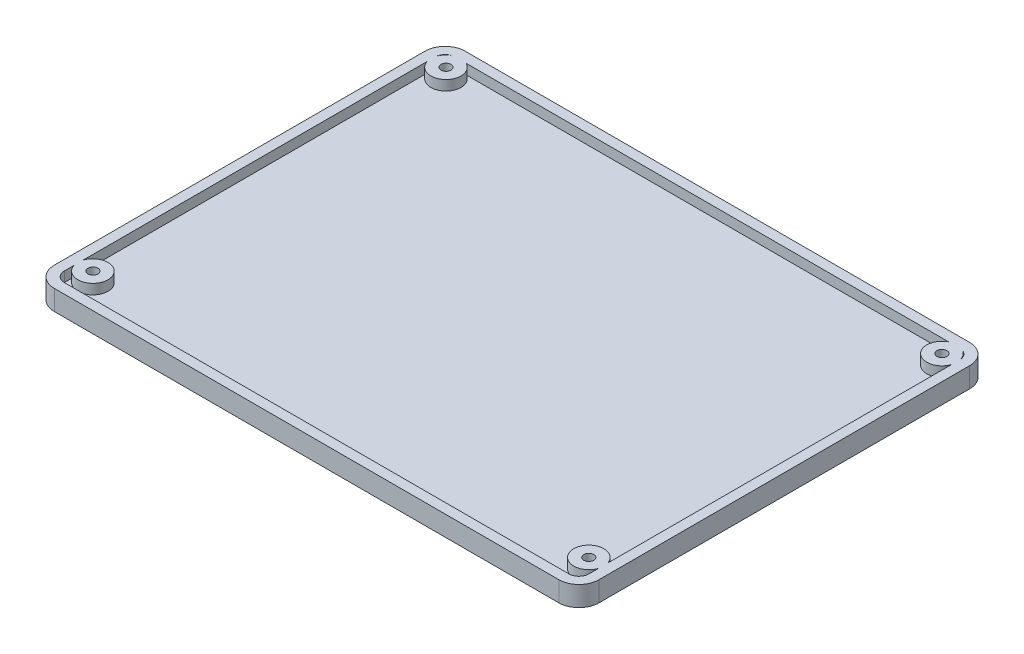
ISO-10303-21;
HEADER;
FILE_DESCRIPTION(('STEP AP214'),'2;1');
FILE_NAME('part.step','',(''),(''),'','','');
FILE_SCHEMA(('AUTOMOTIVE_DESIGN { 1 0 10303 214 1 1 1 1 }'));
ENDSEC;
DATA;
#1=APPLICATION_CONTEXT('core data for automotive mechanical design processes');
#2=APPLICATION_PROTOCOL_DEFINITION('international standard','automotive_design',2000,#1);
#3=PRODUCT_CONTEXT('',#1,'mechanical');
#4=PRODUCT('Part','Part','',(#3));
#5=PRODUCT_RELATED_PRODUCT_CATEGORY('part','',(#4));
#6=PRODUCT_DEFINITION_FORMATION('','',#4);
#7=PRODUCT_DEFINITION_CONTEXT('part definition',#1,'design');
#8=PRODUCT_DEFINITION('design','',#6,#7);
#9=PRODUCT_DEFINITION_SHAPE('','',#8);
#10=(LENGTH_UNIT() NAMED_UNIT(*) SI_UNIT(.MILLI.,.METRE.));
#11=(NAMED_UNIT(*) PLANE_ANGLE_UNIT() SI_UNIT($,.RADIAN.));
#12=(NAMED_UNIT(*) SI_UNIT($,.STERADIAN.) SOLID_ANGLE_UNIT());
#13=UNCERTAINTY_MEASURE_WITH_UNIT(LENGTH_MEASURE(1.E-05),#10,'distance_accuracy_value','');
#14=(GEOMETRIC_REPRESENTATION_CONTEXT(3) GLOBAL_UNCERTAINTY_ASSIGNED_CONTEXT((#13)) GLOBAL_UNIT_ASSIGNED_CONTEXT((#10,
#11,#12)) REPRESENTATION_CONTEXT('',''));
#15=CARTESIAN_POINT('',(0.,0.,0.));
#16=DIRECTION('',(0.,0.,1.));
#17=DIRECTION('',(1.,0.,0.));
#18=AXIS2_PLACEMENT_3D('',#15,#16,#17);
#19=CARTESIAN_POINT('',(0.,6.,0.));
#20=DIRECTION('',(0.,1.,0.));
#21=DIRECTION('',(0.,0.,1.));
#22=AXIS2_PLACEMENT_3D('',#19,#20,#21);
#23=PLANE('',#22);
#24=CARTESIAN_POINT('',(75.4,6.,-55.4));
#25=DIRECTION('',(0.,1.,0.));
#26=DIRECTION('',(0.,0.,1.));
#27=AXIS2_PLACEMENT_3D('',#24,#25,#26);
#28=CIRCLE('',#27,3.);
#29=CARTESIAN_POINT('',(78.3732612938431,6.,-55.7996464419139));
#30=VERTEX_POINT('',#29);
#31=CARTESIAN_POINT('',(76.445365255341,6.,-58.2119764371214));
#32=VERTEX_POINT('',#31);
#33=EDGE_CURVE('E61',#30,#32,#28,.T.);
#34=ORIENTED_EDGE('',*,*,#33,.F.);
#35=CARTESIAN_POINT('',(74.1074112270485,6.,-54.3669834642291));
#36=DIRECTION('',(0.,1.,0.));
#37=DIRECTION('',(0.,0.,1.));
#38=AXIS2_PLACEMENT_3D('',#35,#36,#37);
#39=CIRCLE('',#38,4.5);
#40=EDGE_CURVE('E280',#30,#32,#39,.T.);
#41=ORIENTED_EDGE('',*,*,#40,.T.);
#42=EDGE_LOOP('',(#34,#41));
#43=FACE_BOUND('',#42,.T.);
#44=CARTESIAN_POINT('',(-75.4,6.,-55.4));
#45=DIRECTION('',(0.,1.,0.));
#46=DIRECTION('',(0.,0.,1.));
#47=AXIS2_PLACEMENT_3D('',#44,#45,#46);
#48=CIRCLE('',#47,3.);
#49=CARTESIAN_POINT('',(-76.4270579337473,6.,-58.2187146007935));
#50=VERTEX_POINT('',#49);
#51=CARTESIAN_POINT('',(-78.3778099520177,6.,-55.7642085798885));
#52=VERTEX_POINT('',#51);
#53=EDGE_CURVE('E69',#50,#52,#48,.T.);
#54=ORIENTED_EDGE('',*,*,#53,.F.);
#55=CARTESIAN_POINT('',(-74.1002216155633,6.,-54.3669834642291));
#56=DIRECTION('',(0.,1.,0.));
#57=DIRECTION('',(0.,0.,1.));
#58=AXIS2_PLACEMENT_3D('',#55,#56,#57);
#59=CIRCLE('',#58,4.5);
#60=EDGE_CURVE('E273',#50,#52,#59,.T.);
#61=ORIENTED_EDGE('',*,*,#60,.T.);
#62=EDGE_LOOP('',(#54,#61));
#63=FACE_BOUND('',#62,.T.);
#64=DIRECTION('',(0.,0.,-1.));
#65=VECTOR('',#64,1.);
#66=CARTESIAN_POINT('',(78.4,6.,-61.4));
#67=LINE('',#66,#65);
#68=CARTESIAN_POINT('',(78.4,6.,49.799940355414));
#69=VERTEX_POINT('',#68);
#70=CARTESIAN_POINT('',(78.4,6.,-53.0165458957607));
#71=VERTEX_POINT('',#70);
#72=EDGE_CURVE('E229',#69,#71,#67,.T.);
#73=ORIENTED_EDGE('',*,*,#72,.F.);
#74=CARTESIAN_POINT('',(74.10741122705,6.,51.150377923887));
#75=DIRECTION('',(0.,1.,0.));
#76=DIRECTION('',(0.,0.,1.));
#77=AXIS2_PLACEMENT_3D('',#74,#75,#76);
#78=CIRCLE('',#77,4.5);
#79=CARTESIAN_POINT('',(78.4,6.,52.50081549236));
#80=VERTEX_POINT('',#79);
#81=EDGE_CURVE('E281',#69,#80,#78,.T.);
#82=ORIENTED_EDGE('',*,*,#81,.T.);
#83=CARTESIAN_POINT('',(78.4,6.,55.4));
#84=VERTEX_POINT('',#83);
#85=EDGE_CURVE('E246',#84,#80,#67,.T.);
#86=ORIENTED_EDGE('',*,*,#85,.F.);
#87=CARTESIAN_POINT('',(75.4,6.,55.4));
#88=DIRECTION('',(0.,1.,0.));
#89=DIRECTION('',(0.,0.,1.));
#90=AXIS2_PLACEMENT_3D('',#87,#88,#89);
#91=CIRCLE('',#90,3.);
#92=CARTESIAN_POINT('',(75.4,6.,58.4));
#93=VERTEX_POINT('',#92);
#94=EDGE_CURVE('E264',#93,#84,#91,.T.);
#95=ORIENTED_EDGE('',*,*,#94,.F.);
#96=DIRECTION('',(1.,0.,0.));
#97=VECTOR('',#96,1.);
#98=CARTESIAN_POINT('',(-81.4,6.,58.4));
#99=LINE('',#98,#97);
#100=CARTESIAN_POINT('',(-75.4,6.,58.4));
#101=VERTEX_POINT('',#100);
#102=EDGE_CURVE('E219',#101,#93,#99,.T.);
#103=ORIENTED_EDGE('',*,*,#102,.F.);
#104=CARTESIAN_POINT('',(-75.4,6.,55.4));
#105=DIRECTION('',(0.,1.,0.));
#106=DIRECTION('',(0.,0.,1.));
#107=AXIS2_PLACEMENT_3D('',#104,#105,#106);
#108=CIRCLE('',#107,3.);
#109=CARTESIAN_POINT('',(-78.4,6.,55.4));
#110=VERTEX_POINT('',#109);
#111=EDGE_CURVE('E258',#110,#101,#108,.T.);
#112=ORIENTED_EDGE('',*,*,#111,.F.);
#113=DIRECTION('',(0.,0.,1.));
#114=VECTOR('',#113,1.);
#115=CARTESIAN_POINT('',(-78.4,6.,-61.4));
#116=LINE('',#115,#114);
#117=CARTESIAN_POINT('',(-78.4,6.,52.4777459379352));
#118=VERTEX_POINT('',#117);
#119=EDGE_CURVE('E255',#118,#110,#116,.T.);
#120=ORIENTED_EDGE('',*,*,#119,.F.);
#121=CARTESIAN_POINT('',(-74.1002216155618,6.,51.150377923887));
#122=DIRECTION('',(0.,1.,0.));
#123=DIRECTION('',(0.,0.,1.));
#124=AXIS2_PLACEMENT_3D('',#121,#122,#123);
#125=CIRCLE('',#124,4.5);
#126=CARTESIAN_POINT('',(-78.4,6.,49.8230099098388));
#127=VERTEX_POINT('',#126);
#128=EDGE_CURVE('E287',#118,#127,#125,.T.);
#129=ORIENTED_EDGE('',*,*,#128,.T.);
#130=CARTESIAN_POINT('',(-78.4,6.,-53.0396154501761));
#131=VERTEX_POINT('',#130);
#132=EDGE_CURVE('E261',#131,#127,#116,.T.);
#133=ORIENTED_EDGE('',*,*,#132,.F.);
#134=CARTESIAN_POINT('',(-72.1040308375567,6.,-58.4));
#135=VERTEX_POINT('',#134);
#136=EDGE_CURVE('E269',#131,#135,#59,.T.);
#137=ORIENTED_EDGE('',*,*,#136,.T.);
#138=DIRECTION('',(-1.,0.,0.));
#139=VECTOR('',#138,1.);
#140=CARTESIAN_POINT('',(-81.4,6.,-58.4));
#141=LINE('',#140,#139);
#142=CARTESIAN_POINT('',(72.1112204490419,6.,-58.4));
#143=VERTEX_POINT('',#142);
#144=EDGE_CURVE('E249',#143,#135,#141,.T.);
#145=ORIENTED_EDGE('',*,*,#144,.F.);
#146=EDGE_CURVE('E275',#143,#71,#39,.T.);
#147=ORIENTED_EDGE('',*,*,#146,.T.);
#148=EDGE_LOOP('',(#73,#82,#86,#95,#103,#112,#120,#129,#133,#137,#145,#147));
#149=FACE_BOUND('',#148,.T.);
#150=CARTESIAN_POINT('',(74.10741122705,6.,51.150377923887));
#151=DIRECTION('',(0.,1.,0.));
#152=DIRECTION('',(0.,0.,1.));
#153=AXIS2_PLACEMENT_3D('',#150,#151,#152);
#154=CIRCLE('',#153,1.5);
#155=CARTESIAN_POINT('',(74.10741122705,6.,52.650377923887));
#156=VERTEX_POINT('',#155);
#157=EDGE_CURVE('E337',#156,#156,#154,.T.);
#158=ORIENTED_EDGE('',*,*,#157,.F.);
#159=EDGE_LOOP('',(#158));
#160=FACE_BOUND('',#159,.T.);
#161=CARTESIAN_POINT('',(-74.1002216155633,6.,-54.3669834642291));
#162=DIRECTION('',(0.,1.,0.));
#163=DIRECTION('',(0.,0.,1.));
#164=AXIS2_PLACEMENT_3D('',#161,#162,#163);
#165=CIRCLE('',#164,1.5);
#166=CARTESIAN_POINT('',(-74.1002216155633,6.,-52.8669834642291));
#167=VERTEX_POINT('',#166);
#168=EDGE_CURVE('E353',#167,#167,#165,.T.);
#169=ORIENTED_EDGE('',*,*,#168,.F.);
#170=EDGE_LOOP('',(#169));
#171=FACE_BOUND('',#170,.T.);
#172=DIRECTION('',(0.,0.,-1.));
#173=VECTOR('',#172,1.);
#174=CARTESIAN_POINT('',(81.4,6.,-61.4));
#175=LINE('',#174,#173);
#176=CARTESIAN_POINT('',(81.4,6.,55.4));
#177=VERTEX_POINT('',#176);
#178=CARTESIAN_POINT('',(81.4,6.,-55.4));
#179=VERTEX_POINT('',#178);
#180=EDGE_CURVE('E361',#177,#179,#175,.T.);
#181=ORIENTED_EDGE('',*,*,#180,.T.);
#182=CARTESIAN_POINT('',(75.4,6.,-55.4));
#183=DIRECTION('',(0.,1.,0.));
#184=DIRECTION('',(0.,0.,1.));
#185=AXIS2_PLACEMENT_3D('',#182,#183,#184);
#186=CIRCLE('',#185,6.);
#187=CARTESIAN_POINT('',(75.4,6.,-61.4));
#188=VERTEX_POINT('',#187);
#189=EDGE_CURVE('E427',#179,#188,#186,.T.);
#190=ORIENTED_EDGE('',*,*,#189,.T.);
#191=DIRECTION('',(-1.,0.,0.));
#192=VECTOR('',#191,1.);
#193=CARTESIAN_POINT('',(-81.4,6.,-61.4));
#194=LINE('',#193,#192);
#195=CARTESIAN_POINT('',(-75.4,6.,-61.4));
#196=VERTEX_POINT('',#195);
#197=EDGE_CURVE('E365',#188,#196,#194,.T.);
#198=ORIENTED_EDGE('',*,*,#197,.T.);
#199=CARTESIAN_POINT('',(-75.4,6.,-55.4));
#200=DIRECTION('',(0.,1.,0.));
#201=DIRECTION('',(0.,0.,1.));
#202=AXIS2_PLACEMENT_3D('',#199,#200,#201);
#203=CIRCLE('',#202,6.);
#204=CARTESIAN_POINT('',(-81.4,6.,-55.4));
#205=VERTEX_POINT('',#204);
#206=EDGE_CURVE('E424',#196,#205,#203,.T.);
#207=ORIENTED_EDGE('',*,*,#206,.T.);
#208=DIRECTION('',(0.,0.,1.));
#209=VECTOR('',#208,1.);
#210=CARTESIAN_POINT('',(-81.4,6.,-61.4));
#211=LINE('',#210,#209);
#212=CARTESIAN_POINT('',(-81.4,6.,55.4));
#213=VERTEX_POINT('',#212);
#214=EDGE_CURVE('E370',#205,#213,#211,.T.);
#215=ORIENTED_EDGE('',*,*,#214,.T.);
#216=CARTESIAN_POINT('',(-75.4,6.,55.4));
#217=DIRECTION('',(0.,1.,0.));
#218=DIRECTION('',(0.,0.,1.));
#219=AXIS2_PLACEMENT_3D('',#216,#217,#218);
#220=CIRCLE('',#219,6.);
#221=CARTESIAN_POINT('',(-75.4,6.,61.4));
#222=VERTEX_POINT('',#221);
#223=EDGE_CURVE('E421',#213,#222,#220,.T.);
#224=ORIENTED_EDGE('',*,*,#223,.T.);
#225=DIRECTION('',(1.,0.,0.));
#226=VECTOR('',#225,1.);
#227=CARTESIAN_POINT('',(-81.4,6.,61.4));
#228=LINE('',#227,#226);
#229=CARTESIAN_POINT('',(75.4,6.,61.4));
#230=VERTEX_POINT('',#229);
#231=EDGE_CURVE('E374',#222,#230,#228,.T.);
#232=ORIENTED_EDGE('',*,*,#231,.T.);
#233=CARTESIAN_POINT('',(75.4,6.,55.4));
#234=DIRECTION('',(0.,1.,0.));
#235=DIRECTION('',(0.,0.,1.));
#236=AXIS2_PLACEMENT_3D('',#233,#234,#235);
#237=CIRCLE('',#236,6.);
#238=EDGE_CURVE('E418',#230,#177,#237,.T.);
#239=ORIENTED_EDGE('',*,*,#238,.T.);
#240=EDGE_LOOP('',(#181,#190,#198,#207,#215,#224,#232,#239));
#241=FACE_BOUND('',#240,.T.);
#242=CARTESIAN_POINT('',(74.1074112270485,6.,-54.3669834642291));
#243=DIRECTION('',(0.,1.,0.));
#244=DIRECTION('',(0.,0.,1.));
#245=AXIS2_PLACEMENT_3D('',#242,#243,#244);
#246=CIRCLE('',#245,1.5);
#247=CARTESIAN_POINT('',(74.1074112270485,6.,-52.8669834642291));
#248=VERTEX_POINT('',#247);
#249=EDGE_CURVE('E345',#248,#248,#246,.T.);
#250=ORIENTED_EDGE('',*,*,#249,.F.);
#251=EDGE_LOOP('',(#250));
#252=FACE_BOUND('',#251,.T.);
#253=CARTESIAN_POINT('',(-74.1002216155618,6.,51.150377923887));
#254=DIRECTION('',(0.,1.,0.));
#255=DIRECTION('',(0.,0.,1.));
#256=AXIS2_PLACEMENT_3D('',#253,#254,#255);
#257=CIRCLE('',#256,1.5);
#258=CARTESIAN_POINT('',(-74.1002216155618,6.,52.650377923887));
#259=VERTEX_POINT('',#258);
#260=EDGE_CURVE('E329',#259,#259,#257,.T.);
#261=ORIENTED_EDGE('',*,*,#260,.F.);
#262=EDGE_LOOP('',(#261));
#263=FACE_BOUND('',#262,.T.);
#264=ADVANCED_FACE('F45',(#43,#63,#149,#160,#171,#241,#252,#263),#23,.T.);
#265=CARTESIAN_POINT('',(0.,0.,0.));
#266=DIRECTION('',(0.,1.,0.));
#267=DIRECTION('',(0.,0.,1.));
#268=AXIS2_PLACEMENT_3D('',#265,#266,#267);
#269=PLANE('',#268);
#270=DIRECTION('',(-1.,0.,0.));
#271=VECTOR('',#270,1.);
#272=CARTESIAN_POINT('',(-81.4,0.,-61.4));
#273=LINE('',#272,#271);
#274=CARTESIAN_POINT('',(75.4,0.,-61.4));
#275=VERTEX_POINT('',#274);
#276=CARTESIAN_POINT('',(-75.4,0.,-61.4));
#277=VERTEX_POINT('',#276);
#278=EDGE_CURVE('E382',#275,#277,#273,.T.);
#279=ORIENTED_EDGE('',*,*,#278,.F.);
#280=CARTESIAN_POINT('',(75.4,0.,-55.4));
#281=DIRECTION('',(0.,1.,0.));
#282=DIRECTION('',(0.,0.,1.));
#283=AXIS2_PLACEMENT_3D('',#280,#281,#282);
#284=CIRCLE('',#283,6.);
#285=CARTESIAN_POINT('',(81.4,0.,-55.4));
#286=VERTEX_POINT('',#285);
#287=EDGE_CURVE('E408',#275,#286,#284,.F.);
#288=ORIENTED_EDGE('',*,*,#287,.T.);
#289=DIRECTION('',(0.,0.,-1.));
#290=VECTOR('',#289,1.);
#291=CARTESIAN_POINT('',(81.4,0.,-61.4));
#292=LINE('',#291,#290);
#293=CARTESIAN_POINT('',(81.4,0.,55.4));
#294=VERTEX_POINT('',#293);
#295=EDGE_CURVE('E357',#294,#286,#292,.T.);
#296=ORIENTED_EDGE('',*,*,#295,.F.);
#297=CARTESIAN_POINT('',(75.4,0.,55.4));
#298=DIRECTION('',(0.,1.,0.));
#299=DIRECTION('',(0.,0.,1.));
#300=AXIS2_PLACEMENT_3D('',#297,#298,#299);
#301=CIRCLE('',#300,6.);
#302=CARTESIAN_POINT('',(75.4,0.,61.4));
#303=VERTEX_POINT('',#302);
#304=EDGE_CURVE('E399',#294,#303,#301,.F.);
#305=ORIENTED_EDGE('',*,*,#304,.T.);
#306=DIRECTION('',(1.,0.,0.));
#307=VECTOR('',#306,1.);
#308=CARTESIAN_POINT('',(-81.4,0.,61.4));
#309=LINE('',#308,#307);
#310=CARTESIAN_POINT('',(-75.4,0.,61.4));
#311=VERTEX_POINT('',#310);
#312=EDGE_CURVE('E366',#311,#303,#309,.T.);
#313=ORIENTED_EDGE('',*,*,#312,.F.);
#314=CARTESIAN_POINT('',(-75.4,0.,55.4));
#315=DIRECTION('',(0.,1.,0.));
#316=DIRECTION('',(0.,0.,1.));
#317=AXIS2_PLACEMENT_3D('',#314,#315,#316);
#318=CIRCLE('',#317,6.);
#319=CARTESIAN_POINT('',(-81.4,0.,55.4));
#320=VERTEX_POINT('',#319);
#321=EDGE_CURVE('E402',#311,#320,#318,.F.);
#322=ORIENTED_EDGE('',*,*,#321,.T.);
#323=DIRECTION('',(0.,0.,1.));
#324=VECTOR('',#323,1.);
#325=CARTESIAN_POINT('',(-81.4,0.,-61.4));
#326=LINE('',#325,#324);
#327=CARTESIAN_POINT('',(-81.4,0.,-55.4));
#328=VERTEX_POINT('',#327);
#329=EDGE_CURVE('E386',#328,#320,#326,.T.);
#330=ORIENTED_EDGE('',*,*,#329,.F.);
#331=CARTESIAN_POINT('',(-75.4,0.,-55.4));
#332=DIRECTION('',(0.,1.,0.));
#333=DIRECTION('',(0.,0.,1.));
#334=AXIS2_PLACEMENT_3D('',#331,#332,#333);
#335=CIRCLE('',#334,6.);
#336=EDGE_CURVE('E405',#328,#277,#335,.F.);
#337=ORIENTED_EDGE('',*,*,#336,.T.);
#338=EDGE_LOOP('',(#279,#288,#296,#305,#313,#322,#330,#337));
#339=FACE_BOUND('',#338,.T.);
#340=CARTESIAN_POINT('',(-74.1002216155633,0.,-54.3669834642291));
#341=DIRECTION('',(0.,1.,0.));
#342=DIRECTION('',(0.,0.,1.));
#343=AXIS2_PLACEMENT_3D('',#340,#341,#342);
#344=CIRCLE('',#343,1.5);
#345=CARTESIAN_POINT('',(-74.1002216155633,0.,-52.8669834642291));
#346=VERTEX_POINT('',#345);
#347=EDGE_CURVE('E349',#346,#346,#344,.T.);
#348=ORIENTED_EDGE('',*,*,#347,.T.);
#349=EDGE_LOOP('',(#348));
#350=FACE_BOUND('',#349,.T.);
#351=CARTESIAN_POINT('',(74.1074112270485,0.,-54.3669834642291));
#352=DIRECTION('',(0.,1.,0.));
#353=DIRECTION('',(0.,0.,1.));
#354=AXIS2_PLACEMENT_3D('',#351,#352,#353);
#355=CIRCLE('',#354,1.5);
#356=CARTESIAN_POINT('',(74.1074112270485,0.,-52.8669834642291));
#357=VERTEX_POINT('',#356);
#358=EDGE_CURVE('E341',#357,#357,#355,.T.);
#359=ORIENTED_EDGE('',*,*,#358,.T.);
#360=EDGE_LOOP('',(#359));
#361=FACE_BOUND('',#360,.T.);
#362=CARTESIAN_POINT('',(74.10741122705,0.,51.150377923887));
#363=DIRECTION('',(0.,1.,0.));
#364=DIRECTION('',(0.,0.,1.));
#365=AXIS2_PLACEMENT_3D('',#362,#363,#364);
#366=CIRCLE('',#365,1.5);
#367=CARTESIAN_POINT('',(74.10741122705,0.,52.650377923887));
#368=VERTEX_POINT('',#367);
#369=EDGE_CURVE('E333',#368,#368,#366,.T.);
#370=ORIENTED_EDGE('',*,*,#369,.T.);
#371=EDGE_LOOP('',(#370));
#372=FACE_BOUND('',#371,.T.);
#373=CARTESIAN_POINT('',(-74.1002216155618,0.,51.150377923887));
#374=DIRECTION('',(0.,1.,0.));
#375=DIRECTION('',(0.,0.,1.));
#376=AXIS2_PLACEMENT_3D('',#373,#374,#375);
#377=CIRCLE('',#376,1.5);
#378=CARTESIAN_POINT('',(-74.1002216155618,0.,52.650377923887));
#379=VERTEX_POINT('',#378);
#380=EDGE_CURVE('E328',#379,#379,#377,.T.);
#381=ORIENTED_EDGE('',*,*,#380,.T.);
#382=EDGE_LOOP('',(#381));
#383=FACE_BOUND('',#382,.T.);
#384=ADVANCED_FACE('F456',(#339,#350,#361,#372,#383),#269,.F.);
#385=CARTESIAN_POINT('',(81.4,6.,-61.4));
#386=DIRECTION('',(-1.,0.,0.));
#387=DIRECTION('',(0.,0.,1.));
#388=AXIS2_PLACEMENT_3D('',#385,#386,#387);
#389=PLANE('',#388);
#390=ORIENTED_EDGE('',*,*,#295,.T.);
#391=DIRECTION('',(0.,-1.,0.));
#392=VECTOR('',#391,1.);
#393=CARTESIAN_POINT('',(81.4,6.,-55.4));
#394=LINE('',#393,#392);
#395=EDGE_CURVE('E415',#286,#179,#394,.F.);
#396=ORIENTED_EDGE('',*,*,#395,.T.);
#397=ORIENTED_EDGE('',*,*,#180,.F.);
#398=DIRECTION('',(0.,-1.,0.));
#399=VECTOR('',#398,1.);
#400=CARTESIAN_POINT('',(81.4,6.,55.4));
#401=LINE('',#400,#399);
#402=EDGE_CURVE('E411',#177,#294,#401,.T.);
#403=ORIENTED_EDGE('',*,*,#402,.T.);
#404=EDGE_LOOP('',(#390,#396,#397,#403));
#405=FACE_BOUND('',#404,.T.);
#406=ADVANCED_FACE('F452',(#405),#389,.F.);
#407=CARTESIAN_POINT('',(-81.4,6.,-61.4));
#408=DIRECTION('',(0.,0.,1.));
#409=DIRECTION('',(1.,0.,0.));
#410=AXIS2_PLACEMENT_3D('',#407,#408,#409);
#411=PLANE('',#410);
#412=ORIENTED_EDGE('',*,*,#197,.F.);
#413=DIRECTION('',(0.,-1.,0.));
#414=VECTOR('',#413,1.);
#415=CARTESIAN_POINT('',(75.4,6.,-61.4));
#416=LINE('',#415,#414);
#417=EDGE_CURVE('E395',#188,#275,#416,.T.);
#418=ORIENTED_EDGE('',*,*,#417,.T.);
#419=ORIENTED_EDGE('',*,*,#278,.T.);
#420=DIRECTION('',(0.,-1.,0.));
#421=VECTOR('',#420,1.);
#422=CARTESIAN_POINT('',(-75.4,6.,-61.4));
#423=LINE('',#422,#421);
#424=EDGE_CURVE('E378',#277,#196,#423,.F.);
#425=ORIENTED_EDGE('',*,*,#424,.T.);
#426=EDGE_LOOP('',(#412,#418,#419,#425));
#427=FACE_BOUND('',#426,.T.);
#428=ADVANCED_FACE('F464',(#427),#411,.F.);
#429=CARTESIAN_POINT('',(-81.4,6.,-61.4));
#430=DIRECTION('',(1.,0.,0.));
#431=DIRECTION('',(0.,0.,-1.));
#432=AXIS2_PLACEMENT_3D('',#429,#430,#431);
#433=PLANE('',#432);
#434=ORIENTED_EDGE('',*,*,#214,.F.);
#435=DIRECTION('',(0.,-1.,0.));
#436=VECTOR('',#435,1.);
#437=CARTESIAN_POINT('',(-81.4,6.,-55.4));
#438=LINE('',#437,#436);
#439=EDGE_CURVE('E433',#205,#328,#438,.T.);
#440=ORIENTED_EDGE('',*,*,#439,.T.);
#441=ORIENTED_EDGE('',*,*,#329,.T.);
#442=DIRECTION('',(0.,-1.,0.));
#443=VECTOR('',#442,1.);
#444=CARTESIAN_POINT('',(-81.4,6.,55.4));
#445=LINE('',#444,#443);
#446=EDGE_CURVE('E430',#320,#213,#445,.F.);
#447=ORIENTED_EDGE('',*,*,#446,.T.);
#448=EDGE_LOOP('',(#434,#440,#441,#447));
#449=FACE_BOUND('',#448,.T.);
#450=ADVANCED_FACE('F473',(#449),#433,.F.);
#451=CARTESIAN_POINT('',(-81.4,6.,61.4));
#452=DIRECTION('',(0.,0.,-1.));
#453=DIRECTION('',(-1.,0.,0.));
#454=AXIS2_PLACEMENT_3D('',#451,#452,#453);
#455=PLANE('',#454);
#456=ORIENTED_EDGE('',*,*,#231,.F.);
#457=DIRECTION('',(0.,-1.,0.));
#458=VECTOR('',#457,1.);
#459=CARTESIAN_POINT('',(-75.4,6.,61.4));
#460=LINE('',#459,#458);
#461=EDGE_CURVE('E11',#222,#311,#460,.T.);
#462=ORIENTED_EDGE('',*,*,#461,.T.);
#463=ORIENTED_EDGE('',*,*,#312,.T.);
#464=DIRECTION('',(0.,-1.,0.));
#465=VECTOR('',#464,1.);
#466=CARTESIAN_POINT('',(75.4,6.,61.4));
#467=LINE('',#466,#465);
#468=EDGE_CURVE('E54',#303,#230,#467,.F.);
#469=ORIENTED_EDGE('',*,*,#468,.T.);
#470=EDGE_LOOP('',(#456,#462,#463,#469));
#471=FACE_BOUND('',#470,.T.);
#472=ADVANCED_FACE('F440',(#471),#455,.F.);
#473=CARTESIAN_POINT('',(-74.1002216155633,6.,-54.3669834642291));
#474=DIRECTION('',(0.,-1.,0.));
#475=DIRECTION('',(0.,0.,-1.));
#476=AXIS2_PLACEMENT_3D('',#473,#474,#475);
#477=CYLINDRICAL_SURFACE('',#476,1.5);
#478=ORIENTED_EDGE('',*,*,#168,.T.);
#479=EDGE_LOOP('',(#478));
#480=FACE_BOUND('',#479,.T.);
#481=ORIENTED_EDGE('',*,*,#347,.F.);
#482=EDGE_LOOP('',(#481));
#483=FACE_BOUND('',#482,.T.);
#484=ADVANCED_FACE('F492',(#480,#483),#477,.F.);
#485=CARTESIAN_POINT('',(74.1074112270485,6.,-54.3669834642291));
#486=DIRECTION('',(0.,-1.,0.));
#487=DIRECTION('',(0.,0.,-1.));
#488=AXIS2_PLACEMENT_3D('',#485,#486,#487);
#489=CYLINDRICAL_SURFACE('',#488,1.5);
#490=ORIENTED_EDGE('',*,*,#249,.T.);
#491=EDGE_LOOP('',(#490));
#492=FACE_BOUND('',#491,.T.);
#493=ORIENTED_EDGE('',*,*,#358,.F.);
#494=EDGE_LOOP('',(#493));
#495=FACE_BOUND('',#494,.T.);
#496=ADVANCED_FACE('F514',(#492,#495),#489,.F.);
#497=CARTESIAN_POINT('',(74.10741122705,6.,51.150377923887));
#498=DIRECTION('',(0.,-1.,0.));
#499=DIRECTION('',(0.,0.,-1.));
#500=AXIS2_PLACEMENT_3D('',#497,#498,#499);
#501=CYLINDRICAL_SURFACE('',#500,1.5);
#502=ORIENTED_EDGE('',*,*,#157,.T.);
#503=EDGE_LOOP('',(#502));
#504=FACE_BOUND('',#503,.T.);
#505=ORIENTED_EDGE('',*,*,#369,.F.);
#506=EDGE_LOOP('',(#505));
#507=FACE_BOUND('',#506,.T.);
#508=ADVANCED_FACE('F508',(#504,#507),#501,.F.);
#509=CARTESIAN_POINT('',(-74.1002216155618,6.,51.150377923887));
#510=DIRECTION('',(0.,-1.,0.));
#511=DIRECTION('',(0.,0.,-1.));
#512=AXIS2_PLACEMENT_3D('',#509,#510,#511);
#513=CYLINDRICAL_SURFACE('',#512,1.5);
#514=ORIENTED_EDGE('',*,*,#260,.T.);
#515=EDGE_LOOP('',(#514));
#516=FACE_BOUND('',#515,.T.);
#517=ORIENTED_EDGE('',*,*,#380,.F.);
#518=EDGE_LOOP('',(#517));
#519=FACE_BOUND('',#518,.T.);
#520=ADVANCED_FACE('F504',(#516,#519),#513,.F.);
#521=CARTESIAN_POINT('',(75.4,6.,-55.4));
#522=DIRECTION('',(0.,-1.,0.));
#523=DIRECTION('',(0.,0.,-1.));
#524=AXIS2_PLACEMENT_3D('',#521,#522,#523);
#525=CYLINDRICAL_SURFACE('',#524,6.);
#526=ORIENTED_EDGE('',*,*,#189,.F.);
#527=ORIENTED_EDGE('',*,*,#395,.F.);
#528=ORIENTED_EDGE('',*,*,#287,.F.);
#529=ORIENTED_EDGE('',*,*,#417,.F.);
#530=EDGE_LOOP('',(#526,#527,#528,#529));
#531=FACE_BOUND('',#530,.T.);
#532=ADVANCED_FACE('F461',(#531),#525,.T.);
#533=CARTESIAN_POINT('',(-75.4,6.,-55.4));
#534=DIRECTION('',(0.,-1.,0.));
#535=DIRECTION('',(0.,0.,-1.));
#536=AXIS2_PLACEMENT_3D('',#533,#534,#535);
#537=CYLINDRICAL_SURFACE('',#536,6.);
#538=ORIENTED_EDGE('',*,*,#206,.F.);
#539=ORIENTED_EDGE('',*,*,#424,.F.);
#540=ORIENTED_EDGE('',*,*,#336,.F.);
#541=ORIENTED_EDGE('',*,*,#439,.F.);
#542=EDGE_LOOP('',(#538,#539,#540,#541));
#543=FACE_BOUND('',#542,.T.);
#544=ADVANCED_FACE('F470',(#543),#537,.T.);
#545=CARTESIAN_POINT('',(-75.4,6.,55.4));
#546=DIRECTION('',(0.,-1.,0.));
#547=DIRECTION('',(0.,0.,-1.));
#548=AXIS2_PLACEMENT_3D('',#545,#546,#547);
#549=CYLINDRICAL_SURFACE('',#548,6.);
#550=ORIENTED_EDGE('',*,*,#223,.F.);
#551=ORIENTED_EDGE('',*,*,#446,.F.);
#552=ORIENTED_EDGE('',*,*,#321,.F.);
#553=ORIENTED_EDGE('',*,*,#461,.F.);
#554=EDGE_LOOP('',(#550,#551,#552,#553));
#555=FACE_BOUND('',#554,.T.);
#556=ADVANCED_FACE('F476',(#555),#549,.T.);
#557=CARTESIAN_POINT('',(75.4,6.,55.4));
#558=DIRECTION('',(0.,-1.,0.));
#559=DIRECTION('',(0.,0.,-1.));
#560=AXIS2_PLACEMENT_3D('',#557,#558,#559);
#561=CYLINDRICAL_SURFACE('',#560,6.);
#562=ORIENTED_EDGE('',*,*,#238,.F.);
#563=ORIENTED_EDGE('',*,*,#468,.F.);
#564=ORIENTED_EDGE('',*,*,#304,.F.);
#565=ORIENTED_EDGE('',*,*,#402,.F.);
#566=EDGE_LOOP('',(#562,#563,#564,#565));
#567=FACE_BOUND('',#566,.T.);
#568=ADVANCED_FACE('F47',(#567),#561,.T.);
#569=CARTESIAN_POINT('',(75.4,6.,55.4));
#570=DIRECTION('',(0.,-1.,0.));
#571=DIRECTION('',(0.,0.,-1.));
#572=AXIS2_PLACEMENT_3D('',#569,#570,#571);
#573=CYLINDRICAL_SURFACE('',#572,3.);
#574=ORIENTED_EDGE('',*,*,#94,.T.);
#575=DIRECTION('',(0.,1.,0.));
#576=VECTOR('',#575,1.);
#577=CARTESIAN_POINT('',(78.4,6.,55.4));
#578=LINE('',#577,#576);
#579=CARTESIAN_POINT('',(78.4,3.,55.4));
#580=VERTEX_POINT('',#579);
#581=EDGE_CURVE('E214',#84,#580,#578,.F.);
#582=ORIENTED_EDGE('',*,*,#581,.T.);
#583=CARTESIAN_POINT('',(75.4,3.,55.4));
#584=DIRECTION('',(0.,1.,0.));
#585=DIRECTION('',(0.,0.,1.));
#586=AXIS2_PLACEMENT_3D('',#583,#584,#585);
#587=CIRCLE('',#586,3.);
#588=CARTESIAN_POINT('',(75.4,3.,58.4));
#589=VERTEX_POINT('',#588);
#590=EDGE_CURVE('E207',#580,#589,#587,.F.);
#591=ORIENTED_EDGE('',*,*,#590,.T.);
#592=DIRECTION('',(0.,1.,0.));
#593=VECTOR('',#592,1.);
#594=CARTESIAN_POINT('',(75.4,6.,58.4));
#595=LINE('',#594,#593);
#596=EDGE_CURVE('E211',#589,#93,#595,.T.);
#597=ORIENTED_EDGE('',*,*,#596,.T.);
#598=EDGE_LOOP('',(#574,#582,#591,#597));
#599=FACE_BOUND('',#598,.T.);
#600=ADVANCED_FACE('F209',(#599),#573,.F.);
#601=CARTESIAN_POINT('',(-75.4,6.,55.4));
#602=DIRECTION('',(0.,-1.,0.));
#603=DIRECTION('',(0.,0.,-1.));
#604=AXIS2_PLACEMENT_3D('',#601,#602,#603);
#605=CYLINDRICAL_SURFACE('',#604,3.);
#606=ORIENTED_EDGE('',*,*,#111,.T.);
#607=DIRECTION('',(0.,1.,0.));
#608=VECTOR('',#607,1.);
#609=CARTESIAN_POINT('',(-75.4,6.,58.4));
#610=LINE('',#609,#608);
#611=CARTESIAN_POINT('',(-75.4,3.,58.4));
#612=VERTEX_POINT('',#611);
#613=EDGE_CURVE('E236',#101,#612,#610,.F.);
#614=ORIENTED_EDGE('',*,*,#613,.T.);
#615=CARTESIAN_POINT('',(-75.4,3.,55.4));
#616=DIRECTION('',(0.,1.,0.));
#617=DIRECTION('',(0.,0.,1.));
#618=AXIS2_PLACEMENT_3D('',#615,#616,#617);
#619=CIRCLE('',#618,3.);
#620=CARTESIAN_POINT('',(-78.4,3.,55.4));
#621=VERTEX_POINT('',#620);
#622=EDGE_CURVE('E218',#612,#621,#619,.F.);
#623=ORIENTED_EDGE('',*,*,#622,.T.);
#624=DIRECTION('',(0.,1.,0.));
#625=VECTOR('',#624,1.);
#626=CARTESIAN_POINT('',(-78.4,6.,55.4));
#627=LINE('',#626,#625);
#628=EDGE_CURVE('E237',#621,#110,#627,.T.);
#629=ORIENTED_EDGE('',*,*,#628,.T.);
#630=EDGE_LOOP('',(#606,#614,#623,#629));
#631=FACE_BOUND('',#630,.T.);
#632=ADVANCED_FACE('F622',(#631),#605,.F.);
#633=CARTESIAN_POINT('',(-74.1002216155618,6.,51.150377923887));
#634=DIRECTION('',(0.,-1.,0.));
#635=DIRECTION('',(0.,0.,-1.));
#636=AXIS2_PLACEMENT_3D('',#633,#634,#635);
#637=CYLINDRICAL_SURFACE('',#636,4.5);
#638=DIRECTION('',(0.,-1.,0.));
#639=VECTOR('',#638,1.);
#640=CARTESIAN_POINT('',(-78.4,6.,49.8230099098388));
#641=LINE('',#640,#639);
#642=CARTESIAN_POINT('',(-78.4,3.,49.8230099098388));
#643=VERTEX_POINT('',#642);
#644=EDGE_CURVE('E294',#643,#127,#641,.F.);
#645=ORIENTED_EDGE('',*,*,#644,.T.);
#646=ORIENTED_EDGE('',*,*,#128,.F.);
#647=DIRECTION('',(0.,-1.,0.));
#648=VECTOR('',#647,1.);
#649=CARTESIAN_POINT('',(-78.4,6.,52.4777459379352));
#650=LINE('',#649,#648);
#651=CARTESIAN_POINT('',(-78.4,3.,52.4777459379352));
#652=VERTEX_POINT('',#651);
#653=EDGE_CURVE('E241',#652,#118,#650,.F.);
#654=ORIENTED_EDGE('',*,*,#653,.F.);
#655=CARTESIAN_POINT('',(-74.1002216155618,3.,51.150377923887));
#656=DIRECTION('',(0.,1.,0.));
#657=DIRECTION('',(0.,0.,1.));
#658=AXIS2_PLACEMENT_3D('',#655,#656,#657);
#659=CIRCLE('',#658,4.5);
#660=EDGE_CURVE('E291',#652,#643,#659,.T.);
#661=ORIENTED_EDGE('',*,*,#660,.T.);
#662=EDGE_LOOP('',(#645,#646,#654,#661));
#663=FACE_BOUND('',#662,.T.);
#664=ADVANCED_FACE('F631',(#663),#637,.T.);
#665=CARTESIAN_POINT('',(74.10741122705,6.,51.150377923887));
#666=DIRECTION('',(0.,-1.,0.));
#667=DIRECTION('',(0.,0.,-1.));
#668=AXIS2_PLACEMENT_3D('',#665,#666,#667);
#669=CYLINDRICAL_SURFACE('',#668,4.5);
#670=DIRECTION('',(0.,-1.,0.));
#671=VECTOR('',#670,1.);
#672=CARTESIAN_POINT('',(78.4,6.,52.50081549236));
#673=LINE('',#672,#671);
#674=CARTESIAN_POINT('',(78.4,3.,52.50081549236));
#675=VERTEX_POINT('',#674);
#676=EDGE_CURVE('E324',#675,#80,#673,.F.);
#677=ORIENTED_EDGE('',*,*,#676,.T.);
#678=ORIENTED_EDGE('',*,*,#81,.F.);
#679=DIRECTION('',(0.,-1.,0.));
#680=VECTOR('',#679,1.);
#681=CARTESIAN_POINT('',(78.4,6.,49.799940355414));
#682=LINE('',#681,#680);
#683=CARTESIAN_POINT('',(78.4,3.,49.799940355414));
#684=VERTEX_POINT('',#683);
#685=EDGE_CURVE('E321',#684,#69,#682,.F.);
#686=ORIENTED_EDGE('',*,*,#685,.F.);
#687=CARTESIAN_POINT('',(74.10741122705,3.,51.150377923887));
#688=DIRECTION('',(0.,1.,0.));
#689=DIRECTION('',(0.,0.,1.));
#690=AXIS2_PLACEMENT_3D('',#687,#688,#689);
#691=CIRCLE('',#690,4.5);
#692=EDGE_CURVE('E286',#684,#675,#691,.T.);
#693=ORIENTED_EDGE('',*,*,#692,.T.);
#694=EDGE_LOOP('',(#677,#678,#686,#693));
#695=FACE_BOUND('',#694,.T.);
#696=ADVANCED_FACE('F642',(#695),#669,.T.);
#697=CARTESIAN_POINT('',(74.1074112270485,6.,-54.3669834642291));
#698=DIRECTION('',(0.,-1.,0.));
#699=DIRECTION('',(0.,0.,-1.));
#700=AXIS2_PLACEMENT_3D('',#697,#698,#699);
#701=CYLINDRICAL_SURFACE('',#700,4.5);
#702=DIRECTION('',(0.,-1.,0.));
#703=VECTOR('',#702,1.);
#704=CARTESIAN_POINT('',(78.4,6.,-53.0165458957607));
#705=LINE('',#704,#703);
#706=CARTESIAN_POINT('',(78.4,3.,-53.0165458957607));
#707=VERTEX_POINT('',#706);
#708=EDGE_CURVE('E300',#707,#71,#705,.F.);
#709=ORIENTED_EDGE('',*,*,#708,.T.);
#710=ORIENTED_EDGE('',*,*,#146,.F.);
#711=DIRECTION('',(0.,-1.,0.));
#712=VECTOR('',#711,1.);
#713=CARTESIAN_POINT('',(72.1112204490419,6.,-58.4));
#714=LINE('',#713,#712);
#715=CARTESIAN_POINT('',(72.1112204490419,3.,-58.4));
#716=VERTEX_POINT('',#715);
#717=EDGE_CURVE('E297',#716,#143,#714,.F.);
#718=ORIENTED_EDGE('',*,*,#717,.F.);
#719=CARTESIAN_POINT('',(74.1074112270485,3.,-54.3669834642291));
#720=DIRECTION('',(0.,1.,0.));
#721=DIRECTION('',(0.,0.,1.));
#722=AXIS2_PLACEMENT_3D('',#719,#720,#721);
#723=CIRCLE('',#722,4.5);
#724=EDGE_CURVE('E285',#716,#707,#723,.T.);
#725=ORIENTED_EDGE('',*,*,#724,.T.);
#726=EDGE_LOOP('',(#709,#710,#718,#725));
#727=FACE_BOUND('',#726,.T.);
#728=ADVANCED_FACE('F654',(#727),#701,.T.);
#729=CARTESIAN_POINT('',(-81.4,6.,58.4));
#730=DIRECTION('',(0.,0.,-1.));
#731=DIRECTION('',(-1.,0.,0.));
#732=AXIS2_PLACEMENT_3D('',#729,#730,#731);
#733=PLANE('',#732);
#734=ORIENTED_EDGE('',*,*,#102,.T.);
#735=ORIENTED_EDGE('',*,*,#596,.F.);
#736=DIRECTION('',(1.,0.,0.));
#737=VECTOR('',#736,1.);
#738=CARTESIAN_POINT('',(-81.4,3.,58.4));
#739=LINE('',#738,#737);
#740=EDGE_CURVE('E222',#612,#589,#739,.T.);
#741=ORIENTED_EDGE('',*,*,#740,.F.);
#742=ORIENTED_EDGE('',*,*,#613,.F.);
#743=EDGE_LOOP('',(#734,#735,#741,#742));
#744=FACE_BOUND('',#743,.T.);
#745=ADVANCED_FACE('F232',(#744),#733,.T.);
#746=CARTESIAN_POINT('',(-78.4,6.,-61.4));
#747=DIRECTION('',(1.,0.,0.));
#748=DIRECTION('',(0.,0.,-1.));
#749=AXIS2_PLACEMENT_3D('',#746,#747,#748);
#750=PLANE('',#749);
#751=ORIENTED_EDGE('',*,*,#653,.T.);
#752=ORIENTED_EDGE('',*,*,#119,.T.);
#753=ORIENTED_EDGE('',*,*,#628,.F.);
#754=DIRECTION('',(0.,0.,1.));
#755=VECTOR('',#754,1.);
#756=CARTESIAN_POINT('',(-78.4,3.,-61.4));
#757=LINE('',#756,#755);
#758=EDGE_CURVE('E230',#652,#621,#757,.T.);
#759=ORIENTED_EDGE('',*,*,#758,.F.);
#760=EDGE_LOOP('',(#751,#752,#753,#759));
#761=FACE_BOUND('',#760,.T.);
#762=ADVANCED_FACE('F678',(#761),#750,.T.);
#763=CARTESIAN_POINT('',(-81.4,6.,-58.4));
#764=DIRECTION('',(0.,0.,1.));
#765=DIRECTION('',(1.,0.,0.));
#766=AXIS2_PLACEMENT_3D('',#763,#764,#765);
#767=PLANE('',#766);
#768=DIRECTION('',(-1.,0.,0.));
#769=VECTOR('',#768,1.);
#770=CARTESIAN_POINT('',(-81.4,3.,-58.4));
#771=LINE('',#770,#769);
#772=CARTESIAN_POINT('',(-72.1040308375567,3.,-58.4));
#773=VERTEX_POINT('',#772);
#774=EDGE_CURVE('E894',#716,#773,#771,.T.);
#775=ORIENTED_EDGE('',*,*,#774,.F.);
#776=ORIENTED_EDGE('',*,*,#717,.T.);
#777=ORIENTED_EDGE('',*,*,#144,.T.);
#778=DIRECTION('',(0.,-1.,0.));
#779=VECTOR('',#778,1.);
#780=CARTESIAN_POINT('',(-72.1040308375567,6.,-58.4));
#781=LINE('',#780,#779);
#782=EDGE_CURVE('E309',#773,#135,#781,.F.);
#783=ORIENTED_EDGE('',*,*,#782,.F.);
#784=EDGE_LOOP('',(#775,#776,#777,#783));
#785=FACE_BOUND('',#784,.T.);
#786=ADVANCED_FACE('F690',(#785),#767,.T.);
#787=CARTESIAN_POINT('',(78.4,6.,-61.4));
#788=DIRECTION('',(-1.,0.,0.));
#789=DIRECTION('',(0.,0.,1.));
#790=AXIS2_PLACEMENT_3D('',#787,#788,#789);
#791=PLANE('',#790);
#792=ORIENTED_EDGE('',*,*,#685,.T.);
#793=ORIENTED_EDGE('',*,*,#72,.T.);
#794=ORIENTED_EDGE('',*,*,#708,.F.);
#795=DIRECTION('',(0.,0.,-1.));
#796=VECTOR('',#795,1.);
#797=CARTESIAN_POINT('',(78.4,3.,-61.4));
#798=LINE('',#797,#796);
#799=EDGE_CURVE('E897',#684,#707,#798,.T.);
#800=ORIENTED_EDGE('',*,*,#799,.F.);
#801=EDGE_LOOP('',(#792,#793,#794,#800));
#802=FACE_BOUND('',#801,.T.);
#803=ADVANCED_FACE('F702',(#802),#791,.T.);
#804=CARTESIAN_POINT('',(0.,3.,0.));
#805=DIRECTION('',(0.,1.,0.));
#806=DIRECTION('',(0.,0.,1.));
#807=AXIS2_PLACEMENT_3D('',#804,#805,#806);
#808=PLANE('',#807);
#809=ORIENTED_EDGE('',*,*,#758,.T.);
#810=ORIENTED_EDGE('',*,*,#622,.F.);
#811=ORIENTED_EDGE('',*,*,#740,.T.);
#812=ORIENTED_EDGE('',*,*,#590,.F.);
#813=EDGE_CURVE('E901',#580,#675,#798,.T.);
#814=ORIENTED_EDGE('',*,*,#813,.T.);
#815=ORIENTED_EDGE('',*,*,#692,.F.);
#816=ORIENTED_EDGE('',*,*,#799,.T.);
#817=ORIENTED_EDGE('',*,*,#724,.F.);
#818=ORIENTED_EDGE('',*,*,#774,.T.);
#819=CARTESIAN_POINT('',(-74.1002216155633,3.,-54.3669834642291));
#820=DIRECTION('',(0.,1.,0.));
#821=DIRECTION('',(0.,0.,1.));
#822=AXIS2_PLACEMENT_3D('',#819,#820,#821);
#823=CIRCLE('',#822,4.5);
#824=CARTESIAN_POINT('',(-78.4,3.,-53.0396154501761));
#825=VERTEX_POINT('',#824);
#826=EDGE_CURVE('E274',#825,#773,#823,.T.);
#827=ORIENTED_EDGE('',*,*,#826,.F.);
#828=EDGE_CURVE('E890',#825,#643,#757,.T.);
#829=ORIENTED_EDGE('',*,*,#828,.T.);
#830=ORIENTED_EDGE('',*,*,#660,.F.);
#831=EDGE_LOOP('',(#809,#810,#811,#812,#814,#815,#816,#817,#818,#827,#829,#830));
#832=FACE_BOUND('',#831,.T.);
#833=ADVANCED_FACE('F224',(#832),#808,.T.);
#834=DIRECTION('',(0.,-1.,0.));
#835=VECTOR('',#834,1.);
#836=CARTESIAN_POINT('',(-78.4,6.,-53.0396154501761));
#837=LINE('',#836,#835);
#838=EDGE_CURVE('E318',#825,#131,#837,.F.);
#839=ORIENTED_EDGE('',*,*,#838,.T.);
#840=ORIENTED_EDGE('',*,*,#132,.T.);
#841=ORIENTED_EDGE('',*,*,#644,.F.);
#842=ORIENTED_EDGE('',*,*,#828,.F.);
#843=EDGE_LOOP('',(#839,#840,#841,#842));
#844=FACE_BOUND('',#843,.T.);
#845=ADVANCED_FACE('F693',(#844),#750,.T.);
#846=CARTESIAN_POINT('',(-74.1002216155633,6.,-54.3669834642291));
#847=DIRECTION('',(0.,-1.,0.));
#848=DIRECTION('',(0.,0.,-1.));
#849=AXIS2_PLACEMENT_3D('',#846,#847,#848);
#850=CYLINDRICAL_SURFACE('',#849,4.5);
#851=ORIENTED_EDGE('',*,*,#826,.T.);
#852=ORIENTED_EDGE('',*,*,#782,.T.);
#853=ORIENTED_EDGE('',*,*,#136,.F.);
#854=ORIENTED_EDGE('',*,*,#838,.F.);
#855=EDGE_LOOP('',(#851,#852,#853,#854));
#856=FACE_BOUND('',#855,.T.);
#857=ADVANCED_FACE('F737',(#856),#850,.T.);
#858=ORIENTED_EDGE('',*,*,#813,.F.);
#859=ORIENTED_EDGE('',*,*,#581,.F.);
#860=ORIENTED_EDGE('',*,*,#85,.T.);
#861=ORIENTED_EDGE('',*,*,#676,.F.);
#862=EDGE_LOOP('',(#858,#859,#860,#861));
#863=FACE_BOUND('',#862,.T.);
#864=ADVANCED_FACE('F716',(#863),#791,.T.);
#865=CARTESIAN_POINT('',(-75.4,3.,-55.4));
#866=DIRECTION('',(0.,1.,0.));
#867=DIRECTION('',(0.,0.,1.));
#868=AXIS2_PLACEMENT_3D('',#865,#866,#867);
#869=CIRCLE('',#868,3.);
#870=CARTESIAN_POINT('',(-78.3778099520177,3.,-55.7642085798885));
#871=VERTEX_POINT('',#870);
#872=CARTESIAN_POINT('',(-76.4270579337473,3.,-58.2187146007935));
#873=VERTEX_POINT('',#872);
#874=EDGE_CURVE('E863',#871,#873,#869,.F.);
#875=ORIENTED_EDGE('',*,*,#874,.F.);
#876=EDGE_CURVE('E279',#873,#871,#823,.T.);
#877=ORIENTED_EDGE('',*,*,#876,.F.);
#878=EDGE_LOOP('',(#875,#877));
#879=FACE_BOUND('',#878,.T.);
#880=ADVANCED_FACE('F728',(#879),#808,.T.);
#881=DIRECTION('',(0.,1.,0.));
#882=VECTOR('',#881,1.);
#883=CARTESIAN_POINT('',(-76.4270579337473,6.,-58.2187146007935));
#884=LINE('',#883,#882);
#885=EDGE_CURVE('E315',#50,#873,#884,.F.);
#886=ORIENTED_EDGE('',*,*,#885,.T.);
#887=ORIENTED_EDGE('',*,*,#876,.T.);
#888=DIRECTION('',(0.,1.,0.));
#889=VECTOR('',#888,1.);
#890=CARTESIAN_POINT('',(-78.3778099520177,6.,-55.7642085798885));
#891=LINE('',#890,#889);
#892=EDGE_CURVE('E312',#52,#871,#891,.F.);
#893=ORIENTED_EDGE('',*,*,#892,.F.);
#894=ORIENTED_EDGE('',*,*,#60,.F.);
#895=EDGE_LOOP('',(#886,#887,#893,#894));
#896=FACE_BOUND('',#895,.T.);
#897=ADVANCED_FACE('F748',(#896),#850,.T.);
#898=CARTESIAN_POINT('',(-75.4,6.,-55.4));
#899=DIRECTION('',(0.,-1.,0.));
#900=DIRECTION('',(0.,0.,-1.));
#901=AXIS2_PLACEMENT_3D('',#898,#899,#900);
#902=CYLINDRICAL_SURFACE('',#901,3.);
#903=ORIENTED_EDGE('',*,*,#53,.T.);
#904=ORIENTED_EDGE('',*,*,#892,.T.);
#905=ORIENTED_EDGE('',*,*,#874,.T.);
#906=ORIENTED_EDGE('',*,*,#885,.F.);
#907=EDGE_LOOP('',(#903,#904,#905,#906));
#908=FACE_BOUND('',#907,.T.);
#909=ADVANCED_FACE('F772',(#908),#902,.F.);
#910=CARTESIAN_POINT('',(75.4,6.,-55.4));
#911=DIRECTION('',(0.,-1.,0.));
#912=DIRECTION('',(0.,0.,-1.));
#913=AXIS2_PLACEMENT_3D('',#910,#911,#912);
#914=CYLINDRICAL_SURFACE('',#913,3.);
#915=ORIENTED_EDGE('',*,*,#33,.T.);
#916=DIRECTION('',(0.,1.,0.));
#917=VECTOR('',#916,1.);
#918=CARTESIAN_POINT('',(76.445365255341,6.,-58.2119764371214));
#919=LINE('',#918,#917);
#920=CARTESIAN_POINT('',(76.445365255341,3.,-58.2119764371214));
#921=VERTEX_POINT('',#920);
#922=EDGE_CURVE('E303',#32,#921,#919,.F.);
#923=ORIENTED_EDGE('',*,*,#922,.T.);
#924=CARTESIAN_POINT('',(75.4,3.,-55.4));
#925=DIRECTION('',(0.,1.,0.));
#926=DIRECTION('',(0.,0.,1.));
#927=AXIS2_PLACEMENT_3D('',#924,#925,#926);
#928=CIRCLE('',#927,3.);
#929=CARTESIAN_POINT('',(78.3732612938431,3.,-55.7996464419139));
#930=VERTEX_POINT('',#929);
#931=EDGE_CURVE('E861',#921,#930,#928,.F.);
#932=ORIENTED_EDGE('',*,*,#931,.T.);
#933=DIRECTION('',(0.,1.,0.));
#934=VECTOR('',#933,1.);
#935=CARTESIAN_POINT('',(78.3732612938431,6.,-55.7996464419139));
#936=LINE('',#935,#934);
#937=EDGE_CURVE('E306',#30,#930,#936,.F.);
#938=ORIENTED_EDGE('',*,*,#937,.F.);
#939=EDGE_LOOP('',(#915,#923,#932,#938));
#940=FACE_BOUND('',#939,.T.);
#941=ADVANCED_FACE('F781',(#940),#914,.F.);
#942=EDGE_CURVE('E858',#930,#921,#723,.T.);
#943=ORIENTED_EDGE('',*,*,#942,.F.);
#944=ORIENTED_EDGE('',*,*,#931,.F.);
#945=EDGE_LOOP('',(#943,#944));
#946=FACE_BOUND('',#945,.T.);
#947=ADVANCED_FACE('F727',(#946),#808,.T.);
#948=ORIENTED_EDGE('',*,*,#937,.T.);
#949=ORIENTED_EDGE('',*,*,#942,.T.);
#950=ORIENTED_EDGE('',*,*,#922,.F.);
#951=ORIENTED_EDGE('',*,*,#40,.F.);
#952=EDGE_LOOP('',(#948,#949,#950,#951));
#953=FACE_BOUND('',#952,.T.);
#954=ADVANCED_FACE('F668',(#953),#701,.T.);
#955=CLOSED_SHELL('',(#264,#384,#406,#428,#450,#472,#484,#496,#508,#520,#532,#544,#556,#568,
#600,#632,#664,#696,#728,#745,#762,#786,#803,#833,#845,#857,#864,#880,#897,#909,#941,#947,#954));
#956=MANIFOLD_SOLID_BREP('B2',#955);
#957=ADVANCED_BREP_SHAPE_REPRESENTATION('',(#18,#956),#14);
#958=SHAPE_DEFINITION_REPRESENTATION(#9,#957);
ENDSEC;
END-ISO-10303-21;
